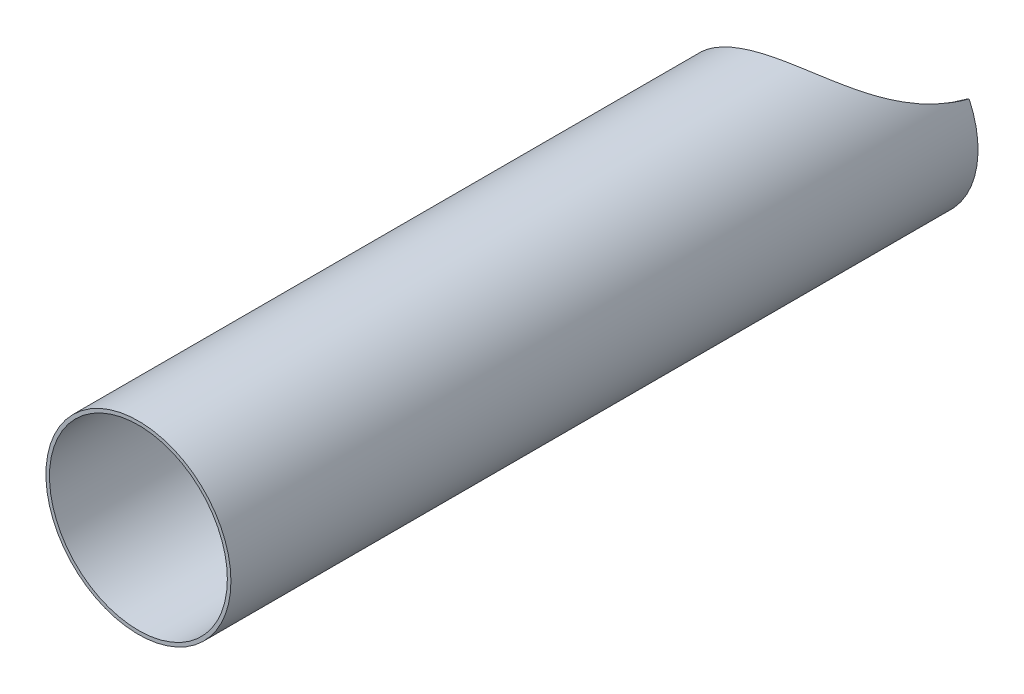
ISO-10303-21;
HEADER;
FILE_DESCRIPTION(('STEP AP214'),'2;1');
FILE_NAME('part.step','',(''),(''),'','','');
FILE_SCHEMA(('AUTOMOTIVE_DESIGN { 1 0 10303 214 1 1 1 1 }'));
ENDSEC;
DATA;
#1=APPLICATION_CONTEXT('core data for automotive mechanical design processes');
#2=APPLICATION_PROTOCOL_DEFINITION('international standard','automotive_design',2000,#1);
#3=PRODUCT_CONTEXT('',#1,'mechanical');
#4=PRODUCT('Part','Part','',(#3));
#5=PRODUCT_RELATED_PRODUCT_CATEGORY('part','',(#4));
#6=PRODUCT_DEFINITION_FORMATION('','',#4);
#7=PRODUCT_DEFINITION_CONTEXT('part definition',#1,'design');
#8=PRODUCT_DEFINITION('design','',#6,#7);
#9=PRODUCT_DEFINITION_SHAPE('','',#8);
#10=(LENGTH_UNIT() NAMED_UNIT(*) SI_UNIT(.MILLI.,.METRE.));
#11=(NAMED_UNIT(*) PLANE_ANGLE_UNIT() SI_UNIT($,.RADIAN.));
#12=(NAMED_UNIT(*) SI_UNIT($,.STERADIAN.) SOLID_ANGLE_UNIT());
#13=UNCERTAINTY_MEASURE_WITH_UNIT(LENGTH_MEASURE(1.E-05),#10,'distance_accuracy_value','');
#14=(GEOMETRIC_REPRESENTATION_CONTEXT(3) GLOBAL_UNCERTAINTY_ASSIGNED_CONTEXT((#13)) GLOBAL_UNIT_ASSIGNED_CONTEXT((#10,
#11,#12)) REPRESENTATION_CONTEXT('',''));
#15=CARTESIAN_POINT('',(0.,0.,0.));
#16=DIRECTION('',(0.,0.,1.));
#17=DIRECTION('',(1.,0.,0.));
#18=AXIS2_PLACEMENT_3D('',#15,#16,#17);
#19=CARTESIAN_POINT('',(0.,0.,0.));
#20=DIRECTION('',(0.,0.,1.));
#21=DIRECTION('',(1.,0.,0.));
#22=AXIS2_PLACEMENT_3D('',#19,#20,#21);
#23=PLANE('',#22);
#24=DIRECTION('',(0.859120199628497,0.511773858838346,0.));
#25=VECTOR('',#24,1.);
#26=CARTESIAN_POINT('',(-26.6636290270254,-18.74608424383,0.));
#27=LINE('',#26,#25);
#28=CARTESIAN_POINT('',(23.4956205369358,11.1335446100655,0.));
#29=VERTEX_POINT('',#28);
#30=CARTESIAN_POINT('',(22.632474915035,10.6193728261282,0.));
#31=VERTEX_POINT('',#30);
#32=EDGE_CURVE('E54',#29,#31,#27,.F.);
#33=ORIENTED_EDGE('',*,*,#32,.F.);
#34=CARTESIAN_POINT('',(0.,0.,0.));
#35=DIRECTION('',(0.,0.,1.));
#36=DIRECTION('',(1.,0.,0.));
#37=AXIS2_PLACEMENT_3D('',#34,#35,#36);
#38=CIRCLE('',#37,26.);
#39=CARTESIAN_POINT('',(-20.9783161644587,-15.3593701337005,0.));
#40=VERTEX_POINT('',#39);
#41=EDGE_CURVE('E72',#40,#29,#38,.T.);
#42=ORIENTED_EDGE('',*,*,#41,.F.);
#43=CARTESIAN_POINT('',(-20.1151705425579,-14.8451983497632,0.));
#44=VERTEX_POINT('',#43);
#45=EDGE_CURVE('E64',#44,#40,#27,.F.);
#46=ORIENTED_EDGE('',*,*,#45,.F.);
#47=CARTESIAN_POINT('',(0.,0.,0.));
#48=DIRECTION('',(0.,0.,1.));
#49=DIRECTION('',(1.,0.,0.));
#50=AXIS2_PLACEMENT_3D('',#47,#48,#49);
#51=CIRCLE('',#50,25.);
#52=EDGE_CURVE('E70',#44,#31,#51,.T.);
#53=ORIENTED_EDGE('',*,*,#52,.T.);
#54=EDGE_LOOP('',(#33,#42,#46,#53));
#55=FACE_BOUND('',#54,.T.);
#56=ADVANCED_FACE('F33',(#55),#23,.F.);
#57=CARTESIAN_POINT('',(0.,0.,210.));
#58=DIRECTION('',(0.,0.,-1.));
#59=DIRECTION('',(-1.,0.,0.));
#60=AXIS2_PLACEMENT_3D('',#57,#58,#59);
#61=CYLINDRICAL_SURFACE('',#60,26.);
#62=CARTESIAN_POINT('',(0.,0.,210.));
#63=DIRECTION('',(0.,0.,1.));
#64=DIRECTION('',(1.,0.,0.));
#65=AXIS2_PLACEMENT_3D('',#62,#63,#64);
#66=CIRCLE('',#65,26.);
#67=CARTESIAN_POINT('',(26.,0.,210.));
#68=VERTEX_POINT('',#67);
#69=EDGE_CURVE('E47',#68,#68,#66,.T.);
#70=ORIENTED_EDGE('',*,*,#69,.F.);
#71=EDGE_LOOP('',(#70));
#72=FACE_BOUND('',#71,.T.);
#73=CARTESIAN_POINT('',(-20.9783161644587,-15.3593701337005,0.));
#74=CARTESIAN_POINT('',(-21.046289668172,-15.2664993892107,0.534335419209202));
#75=CARTESIAN_POINT('',(-21.1190863144638,-15.1658075085039,1.06669363264843));
#76=CARTESIAN_POINT('',(-21.2734911848075,-14.9484644064268,2.12684946932357));
#77=CARTESIAN_POINT('',(-21.3550993266044,-14.8318133340321,2.65464713508233));
#78=CARTESIAN_POINT('',(-21.5263285413005,-14.5821823817684,3.70529898451519));
#79=CARTESIAN_POINT('',(-21.6159528547569,-14.449195890081,4.2281510736223));
#80=CARTESIAN_POINT('',(-21.8022119202808,-14.1665859018995,5.2680503279068));
#81=CARTESIAN_POINT('',(-21.8988468067973,-14.0169620863045,5.78509738153515));
#82=CARTESIAN_POINT('',(-22.1992294602743,-13.5401802921112,7.33431774889841));
#83=CARTESIAN_POINT('',(-22.4121814710727,-13.1869141611049,8.35691157070604));
#84=CARTESIAN_POINT('',(-22.7424435470295,-12.602819126128,9.86698025074196));
#85=CARTESIAN_POINT('',(-22.8543290191816,-12.3991030229462,10.3663347066216));
#86=CARTESIAN_POINT('',(-23.080373433355,-11.9730760059941,11.3566944613145));
#87=CARTESIAN_POINT('',(-23.1945329251295,-11.7507605531497,11.8476976866673));
#88=CARTESIAN_POINT('',(-23.5180628192289,-11.0960996413221,13.2213932059237));
#89=CARTESIAN_POINT('',(-23.7283740755539,-10.6416386380973,14.0934516809615));
#90=CARTESIAN_POINT('',(-24.1417215177424,-9.66732362270301,15.8020352997201));
#91=CARTESIAN_POINT('',(-24.344759096916,-9.14748222147491,16.6385672544841));
#92=CARTESIAN_POINT('',(-24.6350819431861,-8.31853485940511,17.8613473434123));
#93=CARTESIAN_POINT('',(-24.72935924826,-8.03446281095629,18.2630526088784));
#94=CARTESIAN_POINT('',(-24.9117653425838,-7.44968228505005,19.0555580600047));
#95=CARTESIAN_POINT('',(-24.999894977225,-7.14897610525726,19.4463597406088));
#96=CARTESIAN_POINT('',(-25.1684052325232,-6.53099663131115,20.2162714130171));
#97=CARTESIAN_POINT('',(-25.2487871368407,-6.21372609505103,20.5953833345023));
#98=CARTESIAN_POINT('',(-25.4001397979137,-5.56278443904438,21.3411725536339));
#99=CARTESIAN_POINT('',(-25.4711107664197,-5.22911368854192,21.7078501309205));
#100=CARTESIAN_POINT('',(-25.6377113756658,-4.35861298049389,22.6250861878176));
#101=CARTESIAN_POINT('',(-25.7255851154066,-3.81051985760517,23.166477209155));
#102=CARTESIAN_POINT('',(-25.8680063673145,-2.67803298084281,24.2145013041673));
#103=CARTESIAN_POINT('',(-25.9225576327432,-2.09364332338439,24.721138286639));
#104=CARTESIAN_POINT('',(-25.9916604869274,-0.891981743726436,25.6968437393608));
#105=CARTESIAN_POINT('',(-26.0062147999914,-0.274712064000202,26.1659147662241));
#106=CARTESIAN_POINT('',(-25.9888952143658,0.987828216089239,27.0639633161345));
#107=CARTESIAN_POINT('',(-25.9570208812637,1.63309907839241,27.4929404640008));
#108=CARTESIAN_POINT('',(-25.8406041781516,2.9501377798376,28.3118456710531));
#109=CARTESIAN_POINT('',(-25.7556741393705,3.62206625464603,28.7014615625545));
#110=CARTESIAN_POINT('',(-25.5278834046626,4.98006869293028,29.4368030712355));
#111=CARTESIAN_POINT('',(-25.3850216193214,5.66614292218863,29.7825278628766));
#112=CARTESIAN_POINT('',(-25.0378599247576,7.04342106842784,30.4297621054329));
#113=CARTESIAN_POINT('',(-24.8335743531346,7.73462375163728,30.7312818503265));
#114=CARTESIAN_POINT('',(-24.3615588816525,9.11289434647752,31.2909219629036));
#115=CARTESIAN_POINT('',(-24.0938361098202,9.7999627137671,31.54904720098));
#116=CARTESIAN_POINT('',(-23.5308894241502,11.0781010072862,31.9947804519233));
#117=CARTESIAN_POINT('',(-23.2429177560072,11.6707236610179,32.1871422622115));
#118=CARTESIAN_POINT('',(-22.6183902308634,12.8392830658707,32.5410956798026));
#119=CARTESIAN_POINT('',(-22.2818386753282,13.4152212888854,32.7026900084518));
#120=CARTESIAN_POINT('',(-21.5616395781911,14.5445608030295,32.9968069113206));
#121=CARTESIAN_POINT('',(-21.177995287651,15.0979636463873,33.1293314906212));
#122=CARTESIAN_POINT('',(-20.3657280463471,16.1769312622794,33.3670796886441));
#123=CARTESIAN_POINT('',(-19.9371047570926,16.7024958252711,33.4723031018901));
#124=CARTESIAN_POINT('',(-19.050716207417,17.7060816675404,33.6543958371253));
#125=CARTESIAN_POINT('',(-18.5941645640026,18.1850422238014,33.7320022363876));
#126=CARTESIAN_POINT('',(-17.6441248375822,19.1082062435492,33.864323461401));
#127=CARTESIAN_POINT('',(-17.1506377693991,19.5524106612963,33.9190389158228));
#128=CARTESIAN_POINT('',(-16.1299423651889,20.402601363554,34.00657454634));
#129=CARTESIAN_POINT('',(-15.6027334108796,20.8085869469946,34.0393943208576));
#130=CARTESIAN_POINT('',(-14.5181262119228,21.5793100943053,34.0837673434329));
#131=CARTESIAN_POINT('',(-13.9607274861378,21.9440470005047,34.0953202524557));
#132=CARTESIAN_POINT('',(-12.8127314070697,22.6337721672142,34.0973990862191));
#133=CARTESIAN_POINT('',(-12.2218171760058,22.9582339502226,34.0876723542925));
#134=CARTESIAN_POINT('',(-11.0171838768766,23.5600294531351,34.0464776934939));
#135=CARTESIAN_POINT('',(-10.4034646629846,23.8373628716134,34.0150096255742));
#136=CARTESIAN_POINT('',(-9.15769099759463,24.3431434480827,33.9297107391987));
#137=CARTESIAN_POINT('',(-8.52563619998607,24.5715896825747,33.8758794983499));
#138=CARTESIAN_POINT('',(-7.24795286509587,24.9783234152918,33.7448487439005));
#139=CARTESIAN_POINT('',(-6.60232438117453,25.1566111106583,33.6676493221479));
#140=CARTESIAN_POINT('',(-5.30195497995064,25.4624380029974,33.488482172909));
#141=CARTESIAN_POINT('',(-4.64720691245919,25.5899347549516,33.3864938439154));
#142=CARTESIAN_POINT('',(-3.33438345583552,25.7938585576568,33.1562274170862));
#143=CARTESIAN_POINT('',(-2.67630807249102,25.8702856972102,33.0279493649651));
#144=CARTESIAN_POINT('',(-1.3624355000697,25.9726361956512,32.7434773339209));
#145=CARTESIAN_POINT('',(-0.706637783044399,25.9985721635297,32.5872903352453));
#146=CARTESIAN_POINT('',(0.597302608073832,26.0013128923075,32.2453536495612));
#147=CARTESIAN_POINT('',(1.24544539198611,25.9781183589067,32.0596043872143));
#148=CARTESIAN_POINT('',(2.52073889021755,25.8853169039102,31.6595622109649));
#149=CARTESIAN_POINT('',(3.14804930186845,25.8162802442068,31.445645583848));
#150=CARTESIAN_POINT('',(4.38472686871556,25.6352239433879,30.9864926006134));
#151=CARTESIAN_POINT('',(4.99409431607158,25.5232050025569,30.7412567548044));
#152=CARTESIAN_POINT('',(6.19016723016137,25.2597871667233,30.2188210929712));
#153=CARTESIAN_POINT('',(6.77687283001293,25.1083885030813,29.9416214647434));
#154=CARTESIAN_POINT('',(7.92348277100558,24.7704601726005,29.3551115524666));
#155=CARTESIAN_POINT('',(8.48338658226184,24.5839298115498,29.0458006339441));
#156=CARTESIAN_POINT('',(9.58119864899357,24.1774364382478,28.3905352873925));
#157=CARTESIAN_POINT('',(10.1186466647874,23.9570108071934,28.0440977574718));
#158=CARTESIAN_POINT('',(11.1596846693313,23.4901452261777,27.3194531422626));
#159=CARTESIAN_POINT('',(11.6632751314853,23.2437056400733,26.9412465013433));
#160=CARTESIAN_POINT('',(12.6346647708418,22.7303100263249,26.1545746590975));
#161=CARTESIAN_POINT('',(13.1024773819408,22.463361775513,25.7461209294882));
#162=CARTESIAN_POINT('',(14.0017557304722,21.9141161541603,24.9004283964719));
#163=CARTESIAN_POINT('',(14.4332167105351,21.631816782535,24.4631858387439));
#164=CARTESIAN_POINT('',(15.1331336274878,21.1449830975623,23.6998944464402));
#165=CARTESIAN_POINT('',(15.4110616080063,20.943092846957,23.3807731491393));
#166=CARTESIAN_POINT('',(15.949592743728,20.5359302687128,22.7302464205953));
#167=CARTESIAN_POINT('',(16.2101946098529,20.3306576908404,22.3988400781844));
#168=CARTESIAN_POINT('',(16.714402239229,19.9182046823346,21.7243761142492));
#169=CARTESIAN_POINT('',(16.9580046683354,19.711023886407,21.3813162265916));
#170=CARTESIAN_POINT('',(17.4286035022369,19.2961700465689,20.6842553700067));
#171=CARTESIAN_POINT('',(17.6555981036838,19.0884969517227,20.3302532188412));
#172=CARTESIAN_POINT('',(18.3145730558053,18.4646593272122,19.2492622378425));
#173=CARTESIAN_POINT('',(18.7221304029384,18.0496837310985,18.5065414498308));
#174=CARTESIAN_POINT('',(19.4769897882596,17.2324252851299,16.9846645392356));
#175=CARTESIAN_POINT('',(19.8242910167619,16.8301426058943,16.2055079272277));
#176=CARTESIAN_POINT('',(20.3820336587305,16.1466431669868,14.8193702733887));
#177=CARTESIAN_POINT('',(20.604724887405,15.8608503990832,14.2195161797738));
#178=CARTESIAN_POINT('',(21.0221918825555,15.3032282851736,13.0037286421002));
#179=CARTESIAN_POINT('',(21.2169644943153,15.0314005193922,12.3877933902024));
#180=CARTESIAN_POINT('',(21.5809445189884,14.5039847692526,11.1410147090833));
#181=CARTESIAN_POINT('',(21.7501322133092,14.2484093978236,10.5101602100662));
#182=CARTESIAN_POINT('',(22.0649364614313,13.7558716504648,9.23543476383152));
#183=CARTESIAN_POINT('',(22.2105524993459,13.5189096819641,8.59156353207795));
#184=CARTESIAN_POINT('',(22.4788536997435,13.0678723869144,7.2989299770118));
#185=CARTESIAN_POINT('',(22.6017608134924,12.8535853730668,6.65028744678043));
#186=CARTESIAN_POINT('',(22.8283168837929,12.4467711544801,5.34288806564743));
#187=CARTESIAN_POINT('',(22.9319655347333,12.2542442950706,4.6841310544193));
#188=CARTESIAN_POINT('',(23.1215342860422,11.8927048665202,3.3587723673605));
#189=CARTESIAN_POINT('',(23.2074810319934,11.7236570825642,2.69218410216577));
#190=CARTESIAN_POINT('',(23.3632698796903,11.4099798907259,1.351453927136));
#191=CARTESIAN_POINT('',(23.4331126809048,11.2653494223599,0.677312346710508));
#192=CARTESIAN_POINT('',(23.4956205369359,11.1335446100655,0.));
#193=B_SPLINE_CURVE_WITH_KNOTS('',3,(#73,#74,#75,#76,#77,#78,#79,#80,#81,#82,#83,#84,#85,#86,
#87,#88,#89,#90,#91,#92,#93,#94,#95,#96,#97,#98,#99,#100,#101,#102,#103,#104,#105,#106,#107,
#108,#109,#110,#111,#112,#113,#114,#115,#116,#117,#118,#119,#120,#121,#122,#123,#124,#125,#126,
#127,#128,#129,#130,#131,#132,#133,#134,#135,#136,#137,#138,#139,#140,#141,#142,#143,#144,#145,
#146,#147,#148,#149,#150,#151,#152,#153,#154,#155,#156,#157,#158,#159,#160,#161,#162,#163,#164,
#165,#166,#167,#168,#169,#170,#171,#172,#173,#174,#175,#176,#177,#178,#179,#180,#181,#182,#183,
#184,#185,#186,#187,#188,#189,#190,#191,#192),.UNSPECIFIED.,.F.,.F.,(4,2,2,2,2,2,2,2,2,2,2,2,2,
2,2,2,2,2,2,2,2,2,2,2,2,2,2,2,2,2,2,2,2,2,2,2,2,2,2,2,2,2,2,2,2,2,2,2,2,2,2,2,2,2,2,2,2,2,2,4),
(0.,1.63967841220539,3.27934151941039,4.91967048647819,6.56003092019154,9.86461367500154,
11.5166920267483,13.1691747422894,16.1833277772266,19.196900314344,20.6993946611274,
22.2016819848185,23.7037199769495,25.2057241667908,27.5295809225099,29.8531758833988,
32.1766125735701,34.5000710032579,36.8407083685901,39.181389751968,41.5215251948213,
43.8613978164164,45.9180221851735,47.9744645634189,50.0307650542656,52.087081020967,
54.0834585039059,56.0797811552952,58.0761404192398,60.0725315087337,62.0927545831856,
64.1129905781959,66.1332647329266,68.1535309471278,70.1754819351859,72.1974294073658,
74.2188718805823,76.2402853184316,78.2370126211992,80.2337073938667,82.2303904359797,
84.2271129372291,86.2540086870546,88.2808760904651,90.3069786690223,92.3333459948348,
93.7395001932428,95.1457588939831,96.5522926372626,97.9589788819548,100.785871095785,
103.61280129277,105.714282175718,107.816000332548,109.919330141725,112.022705977918,
114.10428911797,116.185905287716,118.264364853411,120.342734124989),.UNSPECIFIED.);
#194=EDGE_CURVE('E58',#40,#29,#193,.T.);
#195=ORIENTED_EDGE('',*,*,#194,.F.);
#196=ORIENTED_EDGE('',*,*,#41,.T.);
#197=EDGE_LOOP('',(#195,#196));
#198=FACE_BOUND('',#197,.T.);
#199=ADVANCED_FACE('F35',(#72,#198),#61,.T.);
#200=CARTESIAN_POINT('',(0.,0.,210.));
#201=DIRECTION('',(0.,0.,-1.));
#202=DIRECTION('',(-1.,0.,0.));
#203=AXIS2_PLACEMENT_3D('',#200,#201,#202);
#204=CYLINDRICAL_SURFACE('',#203,25.);
#205=CARTESIAN_POINT('',(0.,0.,210.));
#206=DIRECTION('',(0.,0.,1.));
#207=DIRECTION('',(1.,0.,0.));
#208=AXIS2_PLACEMENT_3D('',#205,#206,#207);
#209=CIRCLE('',#208,25.);
#210=CARTESIAN_POINT('',(25.,0.,210.));
#211=VERTEX_POINT('',#210);
#212=EDGE_CURVE('E75',#211,#211,#209,.T.);
#213=ORIENTED_EDGE('',*,*,#212,.T.);
#214=EDGE_LOOP('',(#213));
#215=FACE_BOUND('',#214,.T.);
#216=ORIENTED_EDGE('',*,*,#52,.F.);
#217=CARTESIAN_POINT('',(-20.1151705425579,-14.8451983497632,0.));
#218=CARTESIAN_POINT('',(-20.1966751251487,-14.7346963409015,0.637290887843013));
#219=CARTESIAN_POINT('',(-20.2850701305306,-14.6130782532425,1.2717747057505));
#220=CARTESIAN_POINT('',(-20.4741311317451,-14.3470238273567,2.53411892999328));
#221=CARTESIAN_POINT('',(-20.5747975656286,-14.2025866745075,3.16197909901562));
#222=CARTESIAN_POINT('',(-20.7870156974579,-13.8901241825944,4.41078705968266));
#223=CARTESIAN_POINT('',(-20.8985806050335,-13.7220701074323,5.03172542063167));
#224=CARTESIAN_POINT('',(-21.130715945888,-13.3618408257425,6.26485563663977));
#225=CARTESIAN_POINT('',(-21.2512862623595,-13.1696659320591,6.87704760502393));
#226=CARTESIAN_POINT('',(-21.500628931044,-12.7585764312255,8.09727207788421));
#227=CARTESIAN_POINT('',(-21.6294670506361,-12.5394300901856,8.7052131683147));
#228=CARTESIAN_POINT('',(-21.8920958643873,-12.075068918241,9.90996467552207));
#229=CARTESIAN_POINT('',(-22.0258864721302,-11.8298545420593,10.5067752862423));
#230=CARTESIAN_POINT('',(-22.2959011344236,-11.3127283602599,11.6877290317892));
#231=CARTESIAN_POINT('',(-22.4321236647058,-11.0408328281914,12.271879626084));
#232=CARTESIAN_POINT('',(-22.7043899315774,-10.469516782609,13.4265272767643));
#233=CARTESIAN_POINT('',(-22.8404336830158,-10.1700987236839,13.9970255450201));
#234=CARTESIAN_POINT('',(-23.1630579337816,-9.41809423629299,15.3473968610074));
#235=CARTESIAN_POINT('',(-23.3481864958491,-8.95199895767647,16.1201653812101));
#236=CARTESIAN_POINT('',(-23.7036504880613,-7.96322012004638,17.6322541073282));
#237=CARTESIAN_POINT('',(-23.8739862838997,-7.44053796064119,18.3715751398861));
#238=CARTESIAN_POINT('',(-24.1893619523976,-6.34041128861863,19.8091783170255));
#239=CARTESIAN_POINT('',(-24.3345035135431,-5.76320216091702,20.5076175196701));
#240=CARTESIAN_POINT('',(-24.5896193642584,-4.55329923029236,21.8615981302036));
#241=CARTESIAN_POINT('',(-24.6996016518473,-3.92061808791123,22.5171492672295));
#242=CARTESIAN_POINT('',(-24.8555298245068,-2.73572277673398,23.652844957008));
#243=CARTESIAN_POINT('',(-24.9099125602193,-2.19297433082972,24.1417213885894));
#244=CARTESIAN_POINT('',(-24.983051853973,-1.07690364824927,25.0861668673056));
#245=CARTESIAN_POINT('',(-25.0018122241374,-0.503584689824567,25.5417394734277));
#246=CARTESIAN_POINT('',(-24.9979114534921,0.669813878119526,26.4172744845938));
#247=CARTESIAN_POINT('',(-24.975239943429,1.26990015008639,26.8372279476259));
#248=CARTESIAN_POINT('',(-24.8830821420361,2.49144520221756,27.6393721076021));
#249=CARTESIAN_POINT('',(-24.8135953507046,3.11290421058202,28.0215624011739));
#250=CARTESIAN_POINT('',(-24.6225721817121,4.37477602274223,28.7490619142709));
#251=CARTESIAN_POINT('',(-24.5007037795698,5.01528505210574,29.0941180082875));
#252=CARTESIAN_POINT('',(-24.2012258496363,6.30381607861275,29.7437937531106));
#253=CARTESIAN_POINT('',(-24.0236152038216,6.95183822619595,30.0484125926917));
#254=CARTESIAN_POINT('',(-23.6103629290347,8.24698170363453,30.617252903137));
#255=CARTESIAN_POINT('',(-23.3747324131026,8.8941031821601,30.8814820944847));
#256=CARTESIAN_POINT('',(-22.8444928732809,10.1789986620398,31.3704796126492));
#257=CARTESIAN_POINT('',(-22.5498896957163,10.816773583255,31.5952518469358));
#258=CARTESIAN_POINT('',(-21.9381743888051,12.0046697039961,31.9839920301424));
#259=CARTESIAN_POINT('',(-21.6271953104385,12.5566595254495,32.1519404246833));
#260=CARTESIAN_POINT('',(-20.9601647843608,13.640988463818,32.4592102171871));
#261=CARTESIAN_POINT('',(-20.6041169876004,14.1733291679726,32.5985339315978));
#262=CARTESIAN_POINT('',(-19.8487942584029,15.2130957884212,32.8499944177729));
#263=CARTESIAN_POINT('',(-19.449523233265,15.7205239507448,32.9621336440005));
#264=CARTESIAN_POINT('',(-18.6101152349074,16.7057604443563,33.160659945529));
#265=CARTESIAN_POINT('',(-18.1699779756429,17.1835685682784,33.2470468405575));
#266=CARTESIAN_POINT('',(-17.2634242489523,18.0935384366544,33.3934338491845));
#267=CARTESIAN_POINT('',(-16.797961952557,18.5265525297295,33.4540496830714));
#268=CARTESIAN_POINT('',(-15.834010846104,19.3568785618166,33.5529409158794));
#269=CARTESIAN_POINT('',(-15.3355228245503,19.75419135268,33.5912168479618));
#270=CARTESIAN_POINT('',(-14.3088541556259,20.5100721257138,33.6460547741617));
#271=CARTESIAN_POINT('',(-13.7806731118023,20.8686395903807,33.6626164782852));
#272=CARTESIAN_POINT('',(-12.6982480178638,21.5444095314289,33.6743053179905));
#273=CARTESIAN_POINT('',(-12.1440036728041,21.8616115395455,33.669432210948));
#274=CARTESIAN_POINT('',(-11.0092243007201,22.4546163670278,33.6380538819377));
#275=CARTESIAN_POINT('',(-10.428527109443,22.7301006299857,33.6113912681894));
#276=CARTESIAN_POINT('',(-9.24887850070641,23.2351004296602,33.5357815749555));
#277=CARTESIAN_POINT('',(-8.64992702903696,23.464615829847,33.4868344292851));
#278=CARTESIAN_POINT('',(-7.43828692516303,23.876374567119,33.3658689845318));
#279=CARTESIAN_POINT('',(-6.82559886831014,24.0586198800901,33.2938516500621));
#280=CARTESIAN_POINT('',(-5.59119715250198,24.375078890268,33.1256754022249));
#281=CARTESIAN_POINT('',(-4.96948354521596,24.5092928623307,33.0295166270103));
#282=CARTESIAN_POINT('',(-3.72315959359195,24.7292891313789,32.8119939049879));
#283=CARTESIAN_POINT('',(-3.09855697961649,24.8151628015578,32.690678108445));
#284=CARTESIAN_POINT('',(-1.85037345609793,24.9393152636639,32.4213736429313));
#285=CARTESIAN_POINT('',(-1.2267925408915,24.9775943203074,32.2733851223166));
#286=CARTESIAN_POINT('',(0.0140404056299512,25.0076958387151,31.9494406791652));
#287=CARTESIAN_POINT('',(0.631293861213611,24.9995289958673,31.773491204443));
#288=CARTESIAN_POINT('',(1.85448649902858,24.9386417355608,31.3924263980851));
#289=CARTESIAN_POINT('',(2.46042575932366,24.8859216256193,31.1873112677658));
#290=CARTESIAN_POINT('',(3.65264834515118,24.7389747121088,30.7482743710707));
#291=CARTESIAN_POINT('',(4.23902387843092,24.6449857338191,30.5145231148433));
#292=CARTESIAN_POINT('',(5.39119812840769,24.418838251909,30.0168021417973));
#293=CARTESIAN_POINT('',(5.9569970808763,24.2866801857946,29.7528327713693));
#294=CARTESIAN_POINT('',(7.06407771897112,23.9880710933327,29.1945945387587));
#295=CARTESIAN_POINT('',(7.60535793226906,23.8216180109214,28.9003238604737));
#296=CARTESIAN_POINT('',(8.66006652091368,23.4587792734448,28.2818907403979));
#297=CARTESIAN_POINT('',(9.17349400929977,23.2623926659144,27.9577273475701));
#298=CARTESIAN_POINT('',(10.1894177848926,22.8361766601702,27.2671063019026));
#299=CARTESIAN_POINT('',(10.6907035181622,22.6053405205495,26.8994911218234));
#300=CARTESIAN_POINT('',(11.6585154021567,22.1217476215982,26.1342549508803));
#301=CARTESIAN_POINT('',(12.1250414245705,21.8689907813577,25.7366338492643));
#302=CARTESIAN_POINT('',(13.0222632887239,21.3468982601288,24.9131455982238));
#303=CARTESIAN_POINT('',(13.4529650824267,21.0775653461373,24.48728316213));
#304=CARTESIAN_POINT('',(14.278566412947,20.5272680387863,23.6090239911904));
#305=CARTESIAN_POINT('',(14.6734582209589,20.2463011534573,23.1566215628003));
#306=CARTESIAN_POINT('',(15.3267954677284,19.7537083311984,22.3518730142291));
#307=CARTESIAN_POINT('',(15.5934593259569,19.5436645947178,22.0051795785052));
#308=CARTESIAN_POINT('',(16.1082026425254,19.1216251163951,21.2995233395619));
#309=CARTESIAN_POINT('',(16.3562854798226,18.9096297373714,20.9405627844919));
#310=CARTESIAN_POINT('',(16.8345383676781,18.4851454639018,20.2109326824866));
#311=CARTESIAN_POINT('',(17.0647008548286,18.2726563996404,19.8402582834399));
#312=CARTESIAN_POINT('',(17.50762970941,17.848721748997,19.0880908530599));
#313=CARTESIAN_POINT('',(17.7203952003224,17.6372762156951,18.706597277923));
#314=CARTESIAN_POINT('',(18.3354314260536,17.004678382617,17.5435442906674));
#315=CARTESIAN_POINT('',(18.7124191983982,16.5870932102731,16.746526744013));
#316=CARTESIAN_POINT('',(19.4051236983239,15.7711039507026,15.1171453165446));
#317=CARTESIAN_POINT('',(19.7208432230714,15.3726989884393,14.2847830514889));
#318=CARTESIAN_POINT('',(20.1878568478432,14.749207939055,12.9117945113859));
#319=CARTESIAN_POINT('',(20.3560267130903,14.515817773382,12.3805738448263));
#320=CARTESIAN_POINT('',(20.6728594846985,14.060929721261,11.3072869486529));
#321=CARTESIAN_POINT('',(20.8215215257091,13.8394323626252,10.7652202391464));
#322=CARTESIAN_POINT('',(21.1008267061254,13.4097276011807,9.67105112111776));
#323=CARTESIAN_POINT('',(21.2314634851703,13.2015249033524,9.11894524757332));
#324=CARTESIAN_POINT('',(21.4760483593652,12.7997910643037,8.00576987470332));
#325=CARTESIAN_POINT('',(21.589996279003,12.606260077392,7.44470028117754));
#326=CARTESIAN_POINT('',(21.8015053713325,12.2367990832724,6.31979116176498));
#327=CARTESIAN_POINT('',(21.8992107797593,12.0607204638496,5.75602750086139));
#328=CARTESIAN_POINT('',(22.0806993534593,11.7251472872919,4.62136656496926));
#329=CARTESIAN_POINT('',(22.1644824194739,11.5656528483959,4.0504692391529));
#330=CARTESIAN_POINT('',(22.3191471375733,11.2642989977182,2.90278731477892));
#331=CARTESIAN_POINT('',(22.3900386590621,11.1224261219655,2.32600757995543));
#332=CARTESIAN_POINT('',(22.5199359145383,10.8569775056343,1.16693924644061));
#333=CARTESIAN_POINT('',(22.5789419146649,10.7334013553743,0.584650771406054));
#334=CARTESIAN_POINT('',(22.632474915035,10.6193728261282,0.));
#335=B_SPLINE_CURVE_WITH_KNOTS('',3,(#217,#218,#219,#220,#221,#222,#223,#224,#225,#226,#227,
#228,#229,#230,#231,#232,#233,#234,#235,#236,#237,#238,#239,#240,#241,#242,#243,#244,#245,#246,
#247,#248,#249,#250,#251,#252,#253,#254,#255,#256,#257,#258,#259,#260,#261,#262,#263,#264,#265,
#266,#267,#268,#269,#270,#271,#272,#273,#274,#275,#276,#277,#278,#279,#280,#281,#282,#283,#284,
#285,#286,#287,#288,#289,#290,#291,#292,#293,#294,#295,#296,#297,#298,#299,#300,#301,#302,#303,
#304,#305,#306,#307,#308,#309,#310,#311,#312,#313,#314,#315,#316,#317,#318,#319,#320,#321,#322,
#323,#324,#325,#326,#327,#328,#329,#330,#331,#332,#333,#334),.UNSPECIFIED.,.F.,.F.,(4,2,2,2,2,2,
2,2,2,2,2,2,2,2,2,2,2,2,2,2,2,2,2,2,2,2,2,2,2,2,2,2,2,2,2,2,2,2,2,2,2,2,2,2,2,2,2,2,2,2,2,2,2,2,
2,2,2,2,4),(0.,1.9556116453378,3.91129312023836,5.86937512942496,7.82743174512604,
9.80367088404792,11.7798755556954,13.7548822918687,15.7297130582138,18.4910625765848,
21.252343811896,24.0022068853421,26.7514439750505,28.9468430962615,31.1420072638448,
33.3377208955283,35.5334579784829,37.7433230322905,39.9532324122467,42.1627188382405,
44.3719863325517,46.3359057457208,48.2996661663613,50.2632492147322,52.2268460083238,
54.1404576807319,56.0540236812563,57.9676152372468,59.8812284535683,61.8087877068504,
63.7363526849927,65.6638370780862,67.5913104411111,69.5151281397169,71.438935138201,
73.3622991475488,75.2856498814898,77.1980592473891,79.1104466935167,81.0229488249698,
82.9355118236985,84.9227890250277,86.9100735617718,88.8970272618041,90.8844087869134,
92.339529148917,93.7943842516666,95.2498500945471,96.7053892235132,99.6288463933161,
102.552170062957,104.364012072771,106.175934427217,107.98849450712,109.801073647862,
111.596580341515,113.39209983557,115.186238889642,116.980337765106),.UNSPECIFIED.);
#336=EDGE_CURVE('E11',#44,#31,#335,.T.);
#337=ORIENTED_EDGE('',*,*,#336,.T.);
#338=EDGE_LOOP('',(#216,#337));
#339=FACE_BOUND('',#338,.T.);
#340=ADVANCED_FACE('F74',(#215,#339),#204,.F.);
#341=CARTESIAN_POINT('',(0.,0.,210.));
#342=DIRECTION('',(0.,0.,1.));
#343=DIRECTION('',(1.,0.,0.));
#344=AXIS2_PLACEMENT_3D('',#341,#342,#343);
#345=PLANE('',#344);
#346=ORIENTED_EDGE('',*,*,#69,.T.);
#347=EDGE_LOOP('',(#346));
#348=FACE_BOUND('',#347,.T.);
#349=ORIENTED_EDGE('',*,*,#212,.F.);
#350=EDGE_LOOP('',(#349));
#351=FACE_BOUND('',#350,.T.);
#352=ADVANCED_FACE('F89',(#348,#351),#345,.T.);
#353=CARTESIAN_POINT('',(-50.5304242871103,21.3193578537378,-9.99999999999997));
#354=DIRECTION('',(0.859120199628497,0.511773858838346,0.));
#355=DIRECTION('',(-0.511773858838346,0.859120199628497,0.));
#356=AXIS2_PLACEMENT_3D('',#353,#354,#355);
#357=CYLINDRICAL_SURFACE('',#356,47.6955298372958);
#358=ORIENTED_EDGE('',*,*,#194,.T.);
#359=ORIENTED_EDGE('',*,*,#32,.T.);
#360=ORIENTED_EDGE('',*,*,#336,.F.);
#361=ORIENTED_EDGE('',*,*,#45,.T.);
#362=EDGE_LOOP('',(#358,#359,#360,#361));
#363=FACE_BOUND('',#362,.T.);
#364=ADVANCED_FACE('F63',(#363),#357,.F.);
#365=CLOSED_SHELL('',(#56,#199,#340,#352,#364));
#366=MANIFOLD_SOLID_BREP('B2',#365);
#367=ADVANCED_BREP_SHAPE_REPRESENTATION('',(#18,#366),#14);
#368=SHAPE_DEFINITION_REPRESENTATION(#9,#367);
ENDSEC;
END-ISO-10303-21;
